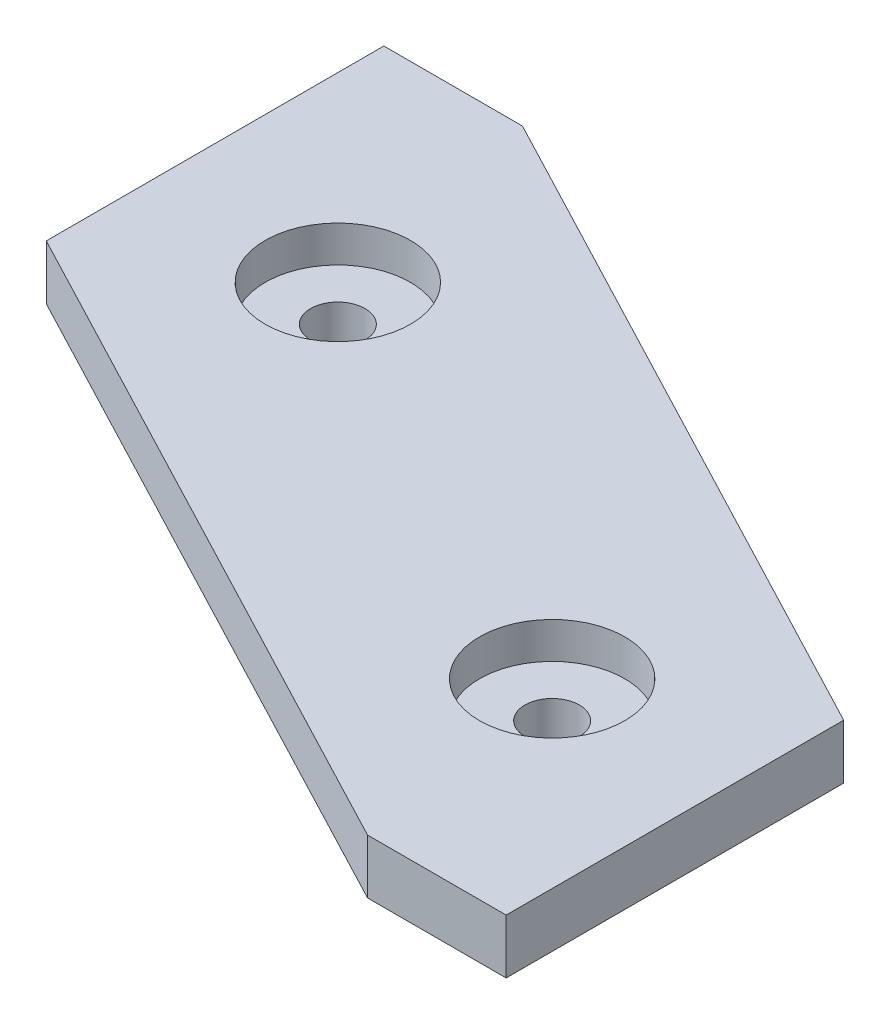
ISO-10303-21;
HEADER;
FILE_DESCRIPTION(('STEP AP214'),'2;1');
FILE_NAME('part.step','',(''),(''),'','','');
FILE_SCHEMA(('AUTOMOTIVE_DESIGN { 1 0 10303 214 1 1 1 1 }'));
ENDSEC;
DATA;
#1=APPLICATION_CONTEXT('core data for automotive mechanical design processes');
#2=APPLICATION_PROTOCOL_DEFINITION('international standard','automotive_design',2000,#1);
#3=PRODUCT_CONTEXT('',#1,'mechanical');
#4=PRODUCT('Part','Part','',(#3));
#5=PRODUCT_RELATED_PRODUCT_CATEGORY('part','',(#4));
#6=PRODUCT_DEFINITION_FORMATION('','',#4);
#7=PRODUCT_DEFINITION_CONTEXT('part definition',#1,'design');
#8=PRODUCT_DEFINITION('design','',#6,#7);
#9=PRODUCT_DEFINITION_SHAPE('','',#8);
#10=(LENGTH_UNIT() NAMED_UNIT(*) SI_UNIT(.MILLI.,.METRE.));
#11=(NAMED_UNIT(*) PLANE_ANGLE_UNIT() SI_UNIT($,.RADIAN.));
#12=(NAMED_UNIT(*) SI_UNIT($,.STERADIAN.) SOLID_ANGLE_UNIT());
#13=UNCERTAINTY_MEASURE_WITH_UNIT(LENGTH_MEASURE(1.E-05),#10,'distance_accuracy_value','');
#14=(GEOMETRIC_REPRESENTATION_CONTEXT(3) GLOBAL_UNCERTAINTY_ASSIGNED_CONTEXT((#13)) GLOBAL_UNIT_ASSIGNED_CONTEXT((#10,
#11,#12)) REPRESENTATION_CONTEXT('',''));
#15=CARTESIAN_POINT('',(0.,0.,0.));
#16=DIRECTION('',(0.,0.,1.));
#17=DIRECTION('',(1.,0.,0.));
#18=AXIS2_PLACEMENT_3D('',#15,#16,#17);
#19=CARTESIAN_POINT('',(24.7991935352745,-2.,13.));
#20=DIRECTION('',(0.,1.,0.));
#21=DIRECTION('',(0.,0.,1.));
#22=AXIS2_PLACEMENT_3D('',#19,#20,#21);
#23=CYLINDRICAL_SURFACE('',#22,1.5);
#24=CARTESIAN_POINT('',(24.7991935352745,-2.,13.));
#25=DIRECTION('',(0.,1.,0.));
#26=DIRECTION('',(0.,0.,1.));
#27=AXIS2_PLACEMENT_3D('',#24,#25,#26);
#28=CIRCLE('',#27,1.5);
#29=CARTESIAN_POINT('',(24.7991935352745,-2.,14.5));
#30=VERTEX_POINT('',#29);
#31=EDGE_CURVE('E139',#30,#30,#28,.T.);
#32=ORIENTED_EDGE('',*,*,#31,.F.);
#33=EDGE_LOOP('',(#32));
#34=FACE_BOUND('',#33,.T.);
#35=CARTESIAN_POINT('',(24.7991935352745,1.,13.));
#36=DIRECTION('',(0.,1.,0.));
#37=DIRECTION('',(0.,0.,1.));
#38=AXIS2_PLACEMENT_3D('',#35,#36,#37);
#39=CIRCLE('',#38,1.5);
#40=CARTESIAN_POINT('',(24.7991935352745,1.,14.5));
#41=VERTEX_POINT('',#40);
#42=EDGE_CURVE('E136',#41,#41,#39,.F.);
#43=ORIENTED_EDGE('',*,*,#42,.F.);
#44=EDGE_LOOP('',(#43));
#45=FACE_BOUND('',#44,.T.);
#46=ADVANCED_FACE('F38',(#34,#45),#23,.F.);
#47=CARTESIAN_POINT('',(0.,-2.,0.));
#48=DIRECTION('',(0.,1.,0.));
#49=DIRECTION('',(0.,0.,1.));
#50=AXIS2_PLACEMENT_3D('',#47,#48,#49);
#51=CYLINDRICAL_SURFACE('',#50,1.5);
#52=CARTESIAN_POINT('',(0.,-2.,0.));
#53=DIRECTION('',(0.,1.,0.));
#54=DIRECTION('',(0.,0.,1.));
#55=AXIS2_PLACEMENT_3D('',#52,#53,#54);
#56=CIRCLE('',#55,1.5);
#57=CARTESIAN_POINT('',(0.,-2.,1.5));
#58=VERTEX_POINT('',#57);
#59=EDGE_CURVE('E172',#58,#58,#56,.T.);
#60=ORIENTED_EDGE('',*,*,#59,.F.);
#61=EDGE_LOOP('',(#60));
#62=FACE_BOUND('',#61,.T.);
#63=CARTESIAN_POINT('',(0.,1.,0.));
#64=DIRECTION('',(0.,1.,0.));
#65=DIRECTION('',(0.,0.,1.));
#66=AXIS2_PLACEMENT_3D('',#63,#64,#65);
#67=CIRCLE('',#66,1.5);
#68=CARTESIAN_POINT('',(0.,1.,1.5));
#69=VERTEX_POINT('',#68);
#70=EDGE_CURVE('E133',#69,#69,#67,.F.);
#71=ORIENTED_EDGE('',*,*,#70,.F.);
#72=EDGE_LOOP('',(#71));
#73=FACE_BOUND('',#72,.T.);
#74=ADVANCED_FACE('F205',(#62,#73),#51,.F.);
#75=CARTESIAN_POINT('',(34.7991935352745,3.,6.95141621090866));
#76=DIRECTION('',(-0.464285714285714,0.,0.88568548340266));
#77=DIRECTION('',(0.88568548340266,0.,0.464285714285714));
#78=AXIS2_PLACEMENT_3D('',#75,#76,#77);
#79=PLANE('',#78);
#80=DIRECTION('',(-0.88568548340266,0.,-0.464285714285714));
#81=VECTOR('',#80,1.);
#82=CARTESIAN_POINT('',(34.7991935352745,0.,6.95141621090866));
#83=LINE('',#82,#81);
#84=CARTESIAN_POINT('',(34.7991935352745,0.,6.95141621090866));
#85=VERTEX_POINT('',#84);
#86=CARTESIAN_POINT('',(-2.36947891222324,0.,-12.532795690183));
#87=VERTEX_POINT('',#86);
#88=EDGE_CURVE('E120',#85,#87,#83,.T.);
#89=ORIENTED_EDGE('',*,*,#88,.T.);
#90=DIRECTION('',(0.,1.,0.));
#91=VECTOR('',#90,1.);
#92=CARTESIAN_POINT('',(-2.36947891222323,-2.,-12.532795690183));
#93=LINE('',#92,#91);
#94=CARTESIAN_POINT('',(-2.36947891222323,3.,-12.532795690183));
#95=VERTEX_POINT('',#94);
#96=EDGE_CURVE('E61',#87,#95,#93,.T.);
#97=ORIENTED_EDGE('',*,*,#96,.T.);
#98=DIRECTION('',(-0.88568548340266,0.,-0.464285714285714));
#99=VECTOR('',#98,1.);
#100=CARTESIAN_POINT('',(34.7991935352745,3.,6.95141621090866));
#101=LINE('',#100,#99);
#102=CARTESIAN_POINT('',(34.7991935352745,3.,6.95141621090866));
#103=VERTEX_POINT('',#102);
#104=EDGE_CURVE('E104',#103,#95,#101,.T.);
#105=ORIENTED_EDGE('',*,*,#104,.F.);
#106=DIRECTION('',(0.,-1.,0.));
#107=VECTOR('',#106,1.);
#108=CARTESIAN_POINT('',(34.7991935352745,3.,6.95141621090866));
#109=LINE('',#108,#107);
#110=EDGE_CURVE('E119',#103,#85,#109,.T.);
#111=ORIENTED_EDGE('',*,*,#110,.T.);
#112=EDGE_LOOP('',(#89,#97,#105,#111));
#113=FACE_BOUND('',#112,.T.);
#114=ADVANCED_FACE('F40',(#113),#79,.F.);
#115=CARTESIAN_POINT('',(-10.,3.,-16.532795690183));
#116=DIRECTION('',(1.,0.,0.));
#117=DIRECTION('',(0.,0.,-1.));
#118=AXIS2_PLACEMENT_3D('',#115,#116,#117);
#119=PLANE('',#118);
#120=DIRECTION('',(0.,0.,1.));
#121=VECTOR('',#120,1.);
#122=CARTESIAN_POINT('',(-10.,3.,-16.532795690183));
#123=LINE('',#122,#121);
#124=CARTESIAN_POINT('',(-10.,3.,-12.532795690183));
#125=VERTEX_POINT('',#124);
#126=CARTESIAN_POINT('',(-10.,3.,6.04858378909134));
#127=VERTEX_POINT('',#126);
#128=EDGE_CURVE('E101',#125,#127,#123,.T.);
#129=ORIENTED_EDGE('',*,*,#128,.F.);
#130=DIRECTION('',(0.,1.,0.));
#131=VECTOR('',#130,1.);
#132=CARTESIAN_POINT('',(-10.,-2.,-12.532795690183));
#133=LINE('',#132,#131);
#134=CARTESIAN_POINT('',(-10.,0.,-12.532795690183));
#135=VERTEX_POINT('',#134);
#136=EDGE_CURVE('E88',#135,#125,#133,.T.);
#137=ORIENTED_EDGE('',*,*,#136,.F.);
#138=DIRECTION('',(0.,0.,1.));
#139=VECTOR('',#138,1.);
#140=CARTESIAN_POINT('',(-10.,0.,-16.532795690183));
#141=LINE('',#140,#139);
#142=CARTESIAN_POINT('',(-10.,0.,6.04858378909134));
#143=VERTEX_POINT('',#142);
#144=EDGE_CURVE('E123',#135,#143,#141,.T.);
#145=ORIENTED_EDGE('',*,*,#144,.T.);
#146=DIRECTION('',(0.,-1.,0.));
#147=VECTOR('',#146,1.);
#148=CARTESIAN_POINT('',(-10.,3.,6.04858378909134));
#149=LINE('',#148,#147);
#150=EDGE_CURVE('E108',#127,#143,#149,.T.);
#151=ORIENTED_EDGE('',*,*,#150,.F.);
#152=EDGE_LOOP('',(#129,#137,#145,#151));
#153=FACE_BOUND('',#152,.T.);
#154=ADVANCED_FACE('F106',(#153),#119,.F.);
#155=CARTESIAN_POINT('',(-10.,3.,6.04858378909134));
#156=DIRECTION('',(0.464285714285714,0.,-0.885685483402661));
#157=DIRECTION('',(-0.885685483402661,0.,-0.464285714285714));
#158=AXIS2_PLACEMENT_3D('',#155,#156,#157);
#159=PLANE('',#158);
#160=DIRECTION('',(0.88568548340266,0.,0.464285714285714));
#161=VECTOR('',#160,1.);
#162=CARTESIAN_POINT('',(-10.,0.,6.04858378909134));
#163=LINE('',#162,#161);
#164=CARTESIAN_POINT('',(27.1686724474977,0.,25.532795690183));
#165=VERTEX_POINT('',#164);
#166=EDGE_CURVE('E126',#143,#165,#163,.T.);
#167=ORIENTED_EDGE('',*,*,#166,.T.);
#168=DIRECTION('',(0.,1.,0.));
#169=VECTOR('',#168,1.);
#170=CARTESIAN_POINT('',(27.1686724474977,-2.,25.532795690183));
#171=LINE('',#170,#169);
#172=CARTESIAN_POINT('',(27.1686724474977,3.,25.532795690183));
#173=VERTEX_POINT('',#172);
#174=EDGE_CURVE('E53',#165,#173,#171,.T.);
#175=ORIENTED_EDGE('',*,*,#174,.T.);
#176=DIRECTION('',(0.88568548340266,0.,0.464285714285714));
#177=VECTOR('',#176,1.);
#178=CARTESIAN_POINT('',(-10.,3.,6.04858378909134));
#179=LINE('',#178,#177);
#180=EDGE_CURVE('E110',#127,#173,#179,.T.);
#181=ORIENTED_EDGE('',*,*,#180,.F.);
#182=ORIENTED_EDGE('',*,*,#150,.T.);
#183=EDGE_LOOP('',(#167,#175,#181,#182));
#184=FACE_BOUND('',#183,.T.);
#185=ADVANCED_FACE('F147',(#184),#159,.F.);
#186=CARTESIAN_POINT('',(34.7991935352745,3.,29.532795690183));
#187=DIRECTION('',(-1.,0.,0.));
#188=DIRECTION('',(0.,0.,1.));
#189=AXIS2_PLACEMENT_3D('',#186,#187,#188);
#190=PLANE('',#189);
#191=DIRECTION('',(0.,0.,-1.));
#192=VECTOR('',#191,1.);
#193=CARTESIAN_POINT('',(34.7991935352745,3.,29.532795690183));
#194=LINE('',#193,#192);
#195=CARTESIAN_POINT('',(34.7991935352745,3.,25.532795690183));
#196=VERTEX_POINT('',#195);
#197=EDGE_CURVE('E112',#196,#103,#194,.T.);
#198=ORIENTED_EDGE('',*,*,#197,.F.);
#199=DIRECTION('',(0.,1.,0.));
#200=VECTOR('',#199,1.);
#201=CARTESIAN_POINT('',(34.7991935352745,-2.,25.532795690183));
#202=LINE('',#201,#200);
#203=CARTESIAN_POINT('',(34.7991935352745,0.,25.532795690183));
#204=VERTEX_POINT('',#203);
#205=EDGE_CURVE('E152',#204,#196,#202,.T.);
#206=ORIENTED_EDGE('',*,*,#205,.F.);
#207=DIRECTION('',(0.,0.,-1.));
#208=VECTOR('',#207,1.);
#209=CARTESIAN_POINT('',(34.7991935352745,0.,29.532795690183));
#210=LINE('',#209,#208);
#211=EDGE_CURVE('E114',#204,#85,#210,.T.);
#212=ORIENTED_EDGE('',*,*,#211,.T.);
#213=ORIENTED_EDGE('',*,*,#110,.F.);
#214=EDGE_LOOP('',(#198,#206,#212,#213));
#215=FACE_BOUND('',#214,.T.);
#216=ADVANCED_FACE('F155',(#215),#190,.F.);
#217=CARTESIAN_POINT('',(0.,3.,0.));
#218=DIRECTION('',(0.,1.,0.));
#219=DIRECTION('',(0.,0.,1.));
#220=AXIS2_PLACEMENT_3D('',#217,#218,#219);
#221=PLANE('',#220);
#222=DIRECTION('',(1.,0.,0.));
#223=VECTOR('',#222,1.);
#224=CARTESIAN_POINT('',(-10.,3.,-12.532795690183));
#225=LINE('',#224,#223);
#226=EDGE_CURVE('E91',#125,#95,#225,.T.);
#227=ORIENTED_EDGE('',*,*,#226,.F.);
#228=ORIENTED_EDGE('',*,*,#128,.T.);
#229=ORIENTED_EDGE('',*,*,#180,.T.);
#230=DIRECTION('',(-1.,0.,0.));
#231=VECTOR('',#230,1.);
#232=CARTESIAN_POINT('',(34.7991935352745,3.,25.532795690183));
#233=LINE('',#232,#231);
#234=EDGE_CURVE('E149',#196,#173,#233,.T.);
#235=ORIENTED_EDGE('',*,*,#234,.F.);
#236=ORIENTED_EDGE('',*,*,#197,.T.);
#237=ORIENTED_EDGE('',*,*,#104,.T.);
#238=EDGE_LOOP('',(#227,#228,#229,#235,#236,#237));
#239=FACE_BOUND('',#238,.T.);
#240=CARTESIAN_POINT('',(0.,3.,0.));
#241=DIRECTION('',(0.,1.,0.));
#242=DIRECTION('',(0.,0.,1.));
#243=AXIS2_PLACEMENT_3D('',#240,#241,#242);
#244=CIRCLE('',#243,4.);
#245=CARTESIAN_POINT('',(0.,3.,4.));
#246=VERTEX_POINT('',#245);
#247=EDGE_CURVE('E167',#246,#246,#244,.T.);
#248=ORIENTED_EDGE('',*,*,#247,.F.);
#249=EDGE_LOOP('',(#248));
#250=FACE_BOUND('',#249,.T.);
#251=CARTESIAN_POINT('',(24.7991935352745,3.,13.));
#252=DIRECTION('',(0.,1.,0.));
#253=DIRECTION('',(0.,0.,1.));
#254=AXIS2_PLACEMENT_3D('',#251,#252,#253);
#255=CIRCLE('',#254,4.);
#256=CARTESIAN_POINT('',(24.7991935352745,3.,17.));
#257=VERTEX_POINT('',#256);
#258=EDGE_CURVE('E157',#257,#257,#255,.T.);
#259=ORIENTED_EDGE('',*,*,#258,.F.);
#260=EDGE_LOOP('',(#259));
#261=FACE_BOUND('',#260,.T.);
#262=ADVANCED_FACE('F98',(#239,#250,#261),#221,.T.);
#263=CARTESIAN_POINT('',(0.,0.,0.));
#264=DIRECTION('',(0.,1.,0.));
#265=DIRECTION('',(0.,0.,1.));
#266=AXIS2_PLACEMENT_3D('',#263,#264,#265);
#267=PLANE('',#266);
#268=CARTESIAN_POINT('',(24.7991935352745,0.,13.));
#269=DIRECTION('',(0.,1.,0.));
#270=DIRECTION('',(0.,0.,1.));
#271=AXIS2_PLACEMENT_3D('',#268,#269,#270);
#272=CIRCLE('',#271,6.);
#273=CARTESIAN_POINT('',(24.7991935352745,0.,19.));
#274=VERTEX_POINT('',#273);
#275=EDGE_CURVE('E175',#274,#274,#272,.T.);
#276=ORIENTED_EDGE('',*,*,#275,.T.);
#277=EDGE_LOOP('',(#276));
#278=FACE_BOUND('',#277,.T.);
#279=CARTESIAN_POINT('',(0.,0.,0.));
#280=DIRECTION('',(0.,1.,0.));
#281=DIRECTION('',(0.,0.,1.));
#282=AXIS2_PLACEMENT_3D('',#279,#280,#281);
#283=CIRCLE('',#282,6.);
#284=CARTESIAN_POINT('',(0.,0.,6.));
#285=VERTEX_POINT('',#284);
#286=EDGE_CURVE('E181',#285,#285,#283,.T.);
#287=ORIENTED_EDGE('',*,*,#286,.T.);
#288=EDGE_LOOP('',(#287));
#289=FACE_BOUND('',#288,.T.);
#290=ORIENTED_EDGE('',*,*,#144,.F.);
#291=DIRECTION('',(1.,0.,0.));
#292=VECTOR('',#291,1.);
#293=CARTESIAN_POINT('',(0.,0.,-12.532795690183));
#294=LINE('',#293,#292);
#295=EDGE_CURVE('E11',#135,#87,#294,.T.);
#296=ORIENTED_EDGE('',*,*,#295,.T.);
#297=ORIENTED_EDGE('',*,*,#88,.F.);
#298=ORIENTED_EDGE('',*,*,#211,.F.);
#299=DIRECTION('',(-1.,0.,0.));
#300=VECTOR('',#299,1.);
#301=CARTESIAN_POINT('',(0.,0.,25.532795690183));
#302=LINE('',#301,#300);
#303=EDGE_CURVE('E46',#204,#165,#302,.T.);
#304=ORIENTED_EDGE('',*,*,#303,.T.);
#305=ORIENTED_EDGE('',*,*,#166,.F.);
#306=EDGE_LOOP('',(#290,#296,#297,#298,#304,#305));
#307=FACE_BOUND('',#306,.T.);
#308=ADVANCED_FACE('F143',(#278,#289,#307),#267,.F.);
#309=CARTESIAN_POINT('',(0.,-2.,0.));
#310=DIRECTION('',(0.,1.,0.));
#311=DIRECTION('',(0.,0.,1.));
#312=AXIS2_PLACEMENT_3D('',#309,#310,#311);
#313=CYLINDRICAL_SURFACE('',#312,6.);
#314=CARTESIAN_POINT('',(0.,-2.,0.));
#315=DIRECTION('',(0.,1.,0.));
#316=DIRECTION('',(0.,0.,1.));
#317=AXIS2_PLACEMENT_3D('',#314,#315,#316);
#318=CIRCLE('',#317,6.);
#319=CARTESIAN_POINT('',(0.,-2.,6.));
#320=VERTEX_POINT('',#319);
#321=EDGE_CURVE('E124',#320,#320,#318,.T.);
#322=ORIENTED_EDGE('',*,*,#321,.T.);
#323=EDGE_LOOP('',(#322));
#324=FACE_BOUND('',#323,.T.);
#325=ORIENTED_EDGE('',*,*,#286,.F.);
#326=EDGE_LOOP('',(#325));
#327=FACE_BOUND('',#326,.T.);
#328=ADVANCED_FACE('F189',(#324,#327),#313,.T.);
#329=CARTESIAN_POINT('',(0.,-2.,0.));
#330=DIRECTION('',(0.,1.,0.));
#331=DIRECTION('',(0.,0.,1.));
#332=AXIS2_PLACEMENT_3D('',#329,#330,#331);
#333=PLANE('',#332);
#334=ORIENTED_EDGE('',*,*,#59,.T.);
#335=EDGE_LOOP('',(#334));
#336=FACE_BOUND('',#335,.T.);
#337=ORIENTED_EDGE('',*,*,#321,.F.);
#338=EDGE_LOOP('',(#337));
#339=FACE_BOUND('',#338,.T.);
#340=ADVANCED_FACE('F191',(#336,#339),#333,.F.);
#341=CARTESIAN_POINT('',(24.7991935352745,-2.,13.));
#342=DIRECTION('',(0.,1.,0.));
#343=DIRECTION('',(0.,0.,1.));
#344=AXIS2_PLACEMENT_3D('',#341,#342,#343);
#345=CYLINDRICAL_SURFACE('',#344,6.);
#346=CARTESIAN_POINT('',(24.7991935352745,-2.,13.));
#347=DIRECTION('',(0.,1.,0.));
#348=DIRECTION('',(0.,0.,1.));
#349=AXIS2_PLACEMENT_3D('',#346,#347,#348);
#350=CIRCLE('',#349,6.);
#351=CARTESIAN_POINT('',(24.7991935352745,-2.,19.));
#352=VERTEX_POINT('',#351);
#353=EDGE_CURVE('E178',#352,#352,#350,.T.);
#354=ORIENTED_EDGE('',*,*,#353,.T.);
#355=EDGE_LOOP('',(#354));
#356=FACE_BOUND('',#355,.T.);
#357=ORIENTED_EDGE('',*,*,#275,.F.);
#358=EDGE_LOOP('',(#357));
#359=FACE_BOUND('',#358,.T.);
#360=ADVANCED_FACE('F198',(#356,#359),#345,.T.);
#361=CARTESIAN_POINT('',(24.7991935352745,-2.,13.));
#362=DIRECTION('',(0.,1.,0.));
#363=DIRECTION('',(0.,0.,1.));
#364=AXIS2_PLACEMENT_3D('',#361,#362,#363);
#365=PLANE('',#364);
#366=ORIENTED_EDGE('',*,*,#31,.T.);
#367=EDGE_LOOP('',(#366));
#368=FACE_BOUND('',#367,.T.);
#369=ORIENTED_EDGE('',*,*,#353,.F.);
#370=EDGE_LOOP('',(#369));
#371=FACE_BOUND('',#370,.T.);
#372=ADVANCED_FACE('F217',(#368,#371),#365,.F.);
#373=CARTESIAN_POINT('',(0.,1.,0.));
#374=DIRECTION('',(0.,1.,0.));
#375=DIRECTION('',(0.,0.,1.));
#376=AXIS2_PLACEMENT_3D('',#373,#374,#375);
#377=PLANE('',#376);
#378=CARTESIAN_POINT('',(0.,1.,0.));
#379=DIRECTION('',(0.,1.,0.));
#380=DIRECTION('',(0.,0.,1.));
#381=AXIS2_PLACEMENT_3D('',#378,#379,#380);
#382=CIRCLE('',#381,4.);
#383=CARTESIAN_POINT('',(0.,1.,4.));
#384=VERTEX_POINT('',#383);
#385=EDGE_CURVE('E137',#384,#384,#382,.T.);
#386=ORIENTED_EDGE('',*,*,#385,.T.);
#387=EDGE_LOOP('',(#386));
#388=FACE_BOUND('',#387,.T.);
#389=ORIENTED_EDGE('',*,*,#70,.T.);
#390=EDGE_LOOP('',(#389));
#391=FACE_BOUND('',#390,.T.);
#392=ADVANCED_FACE('F220',(#388,#391),#377,.T.);
#393=CARTESIAN_POINT('',(0.,1.,0.));
#394=DIRECTION('',(0.,1.,0.));
#395=DIRECTION('',(0.,0.,1.));
#396=AXIS2_PLACEMENT_3D('',#393,#394,#395);
#397=CYLINDRICAL_SURFACE('',#396,4.);
#398=ORIENTED_EDGE('',*,*,#385,.F.);
#399=EDGE_LOOP('',(#398));
#400=FACE_BOUND('',#399,.T.);
#401=ORIENTED_EDGE('',*,*,#247,.T.);
#402=EDGE_LOOP('',(#401));
#403=FACE_BOUND('',#402,.T.);
#404=ADVANCED_FACE('F242',(#400,#403),#397,.F.);
#405=CARTESIAN_POINT('',(24.7991935352745,1.,13.));
#406=DIRECTION('',(0.,1.,0.));
#407=DIRECTION('',(0.,0.,1.));
#408=AXIS2_PLACEMENT_3D('',#405,#406,#407);
#409=PLANE('',#408);
#410=CARTESIAN_POINT('',(24.7991935352745,1.,13.));
#411=DIRECTION('',(0.,1.,0.));
#412=DIRECTION('',(0.,0.,1.));
#413=AXIS2_PLACEMENT_3D('',#410,#411,#412);
#414=CIRCLE('',#413,4.);
#415=CARTESIAN_POINT('',(24.7991935352745,1.,17.));
#416=VERTEX_POINT('',#415);
#417=EDGE_CURVE('E160',#416,#416,#414,.T.);
#418=ORIENTED_EDGE('',*,*,#417,.T.);
#419=EDGE_LOOP('',(#418));
#420=FACE_BOUND('',#419,.T.);
#421=ORIENTED_EDGE('',*,*,#42,.T.);
#422=EDGE_LOOP('',(#421));
#423=FACE_BOUND('',#422,.T.);
#424=ADVANCED_FACE('F251',(#420,#423),#409,.T.);
#425=CARTESIAN_POINT('',(24.7991935352745,1.,13.));
#426=DIRECTION('',(0.,1.,0.));
#427=DIRECTION('',(0.,0.,1.));
#428=AXIS2_PLACEMENT_3D('',#425,#426,#427);
#429=CYLINDRICAL_SURFACE('',#428,4.);
#430=ORIENTED_EDGE('',*,*,#417,.F.);
#431=EDGE_LOOP('',(#430));
#432=FACE_BOUND('',#431,.T.);
#433=ORIENTED_EDGE('',*,*,#258,.T.);
#434=EDGE_LOOP('',(#433));
#435=FACE_BOUND('',#434,.T.);
#436=ADVANCED_FACE('F259',(#432,#435),#429,.F.);
#437=CARTESIAN_POINT('',(34.7991935352745,-2.,25.532795690183));
#438=DIRECTION('',(0.,0.,-1.));
#439=DIRECTION('',(-1.,0.,0.));
#440=AXIS2_PLACEMENT_3D('',#437,#438,#439);
#441=PLANE('',#440);
#442=ORIENTED_EDGE('',*,*,#205,.T.);
#443=ORIENTED_EDGE('',*,*,#234,.T.);
#444=ORIENTED_EDGE('',*,*,#174,.F.);
#445=ORIENTED_EDGE('',*,*,#303,.F.);
#446=EDGE_LOOP('',(#442,#443,#444,#445));
#447=FACE_BOUND('',#446,.T.);
#448=ADVANCED_FACE('F267',(#447),#441,.F.);
#449=CARTESIAN_POINT('',(-10.,-2.,-12.532795690183));
#450=DIRECTION('',(0.,0.,1.));
#451=DIRECTION('',(1.,0.,0.));
#452=AXIS2_PLACEMENT_3D('',#449,#450,#451);
#453=PLANE('',#452);
#454=ORIENTED_EDGE('',*,*,#136,.T.);
#455=ORIENTED_EDGE('',*,*,#226,.T.);
#456=ORIENTED_EDGE('',*,*,#96,.F.);
#457=ORIENTED_EDGE('',*,*,#295,.F.);
#458=EDGE_LOOP('',(#454,#455,#456,#457));
#459=FACE_BOUND('',#458,.T.);
#460=ADVANCED_FACE('F90',(#459),#453,.F.);
#461=CLOSED_SHELL('',(#46,#74,#114,#154,#185,#216,#262,#308,#328,#340,#360,#372,#392,#404,#424,
#436,#448,#460));
#462=MANIFOLD_SOLID_BREP('B2',#461);
#463=ADVANCED_BREP_SHAPE_REPRESENTATION('',(#18,#462),#14);
#464=SHAPE_DEFINITION_REPRESENTATION(#9,#463);
ENDSEC;
END-ISO-10303-21;
